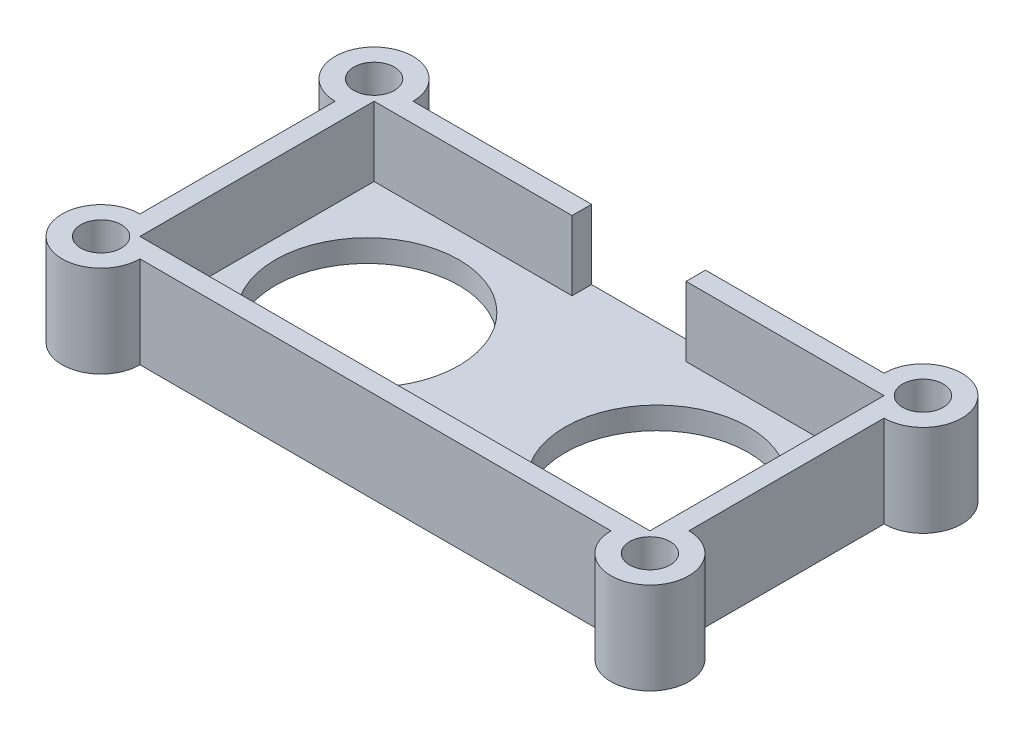
ISO-10303-21;
HEADER;
FILE_DESCRIPTION(('STEP AP214'),'2;1');
FILE_NAME('part.step','',(''),(''),'','','');
FILE_SCHEMA(('AUTOMOTIVE_DESIGN { 1 0 10303 214 1 1 1 1 }'));
ENDSEC;
DATA;
#1=APPLICATION_CONTEXT('core data for automotive mechanical design processes');
#2=APPLICATION_PROTOCOL_DEFINITION('international standard','automotive_design',2000,#1);
#3=PRODUCT_CONTEXT('',#1,'mechanical');
#4=PRODUCT('Part','Part','',(#3));
#5=PRODUCT_RELATED_PRODUCT_CATEGORY('part','',(#4));
#6=PRODUCT_DEFINITION_FORMATION('','',#4);
#7=PRODUCT_DEFINITION_CONTEXT('part definition',#1,'design');
#8=PRODUCT_DEFINITION('design','',#6,#7);
#9=PRODUCT_DEFINITION_SHAPE('','',#8);
#10=(LENGTH_UNIT() NAMED_UNIT(*) SI_UNIT(.MILLI.,.METRE.));
#11=(NAMED_UNIT(*) PLANE_ANGLE_UNIT() SI_UNIT($,.RADIAN.));
#12=(NAMED_UNIT(*) SI_UNIT($,.STERADIAN.) SOLID_ANGLE_UNIT());
#13=UNCERTAINTY_MEASURE_WITH_UNIT(LENGTH_MEASURE(1.E-05),#10,'distance_accuracy_value','');
#14=(GEOMETRIC_REPRESENTATION_CONTEXT(3) GLOBAL_UNCERTAINTY_ASSIGNED_CONTEXT((#13)) GLOBAL_UNIT_ASSIGNED_CONTEXT((#10,
#11,#12)) REPRESENTATION_CONTEXT('',''));
#15=CARTESIAN_POINT('',(0.,0.,0.));
#16=DIRECTION('',(0.,0.,1.));
#17=DIRECTION('',(1.,0.,0.));
#18=AXIS2_PLACEMENT_3D('',#15,#16,#17);
#19=CARTESIAN_POINT('',(-24.675,2.,12.275));
#20=DIRECTION('',(0.,0.,-1.));
#21=DIRECTION('',(-1.,0.,0.));
#22=AXIS2_PLACEMENT_3D('',#19,#20,#21);
#23=PLANE('',#22);
#24=DIRECTION('',(0.,-1.,0.));
#25=VECTOR('',#24,1.);
#26=CARTESIAN_POINT('',(21.175,18.1494949366117,12.275));
#27=LINE('',#26,#25);
#28=CARTESIAN_POINT('',(21.175,8.25,12.275));
#29=VERTEX_POINT('',#28);
#30=CARTESIAN_POINT('',(21.175,0.,12.275));
#31=VERTEX_POINT('',#30);
#32=EDGE_CURVE('E249',#29,#31,#27,.T.);
#33=ORIENTED_EDGE('',*,*,#32,.F.);
#34=DIRECTION('',(1.,0.,0.));
#35=VECTOR('',#34,1.);
#36=CARTESIAN_POINT('',(-24.675,8.25,12.275));
#37=LINE('',#36,#35);
#38=CARTESIAN_POINT('',(-21.175,8.25,12.275));
#39=VERTEX_POINT('',#38);
#40=EDGE_CURVE('E294',#39,#29,#37,.T.);
#41=ORIENTED_EDGE('',*,*,#40,.F.);
#42=DIRECTION('',(0.,-1.,0.));
#43=VECTOR('',#42,1.);
#44=CARTESIAN_POINT('',(-21.175,18.1494949366117,12.275));
#45=LINE('',#44,#43);
#46=CARTESIAN_POINT('',(-21.175,0.,12.275));
#47=VERTEX_POINT('',#46);
#48=EDGE_CURVE('E255',#39,#47,#45,.T.);
#49=ORIENTED_EDGE('',*,*,#48,.T.);
#50=DIRECTION('',(1.,0.,0.));
#51=VECTOR('',#50,1.);
#52=CARTESIAN_POINT('',(-24.675,0.,12.275));
#53=LINE('',#52,#51);
#54=EDGE_CURVE('E361',#47,#31,#53,.T.);
#55=ORIENTED_EDGE('',*,*,#54,.T.);
#56=EDGE_LOOP('',(#33,#41,#49,#55));
#57=FACE_BOUND('',#56,.T.);
#58=ADVANCED_FACE('F32',(#57),#23,.F.);
#59=CARTESIAN_POINT('',(24.675,2.,-12.275));
#60=DIRECTION('',(-1.,0.,0.));
#61=DIRECTION('',(0.,0.,1.));
#62=AXIS2_PLACEMENT_3D('',#59,#60,#61);
#63=PLANE('',#62);
#64=DIRECTION('',(0.,-1.,0.));
#65=VECTOR('',#64,1.);
#66=CARTESIAN_POINT('',(24.675,18.1494949366117,8.775));
#67=LINE('',#66,#65);
#68=CARTESIAN_POINT('',(24.675,8.25,8.775));
#69=VERTEX_POINT('',#68);
#70=CARTESIAN_POINT('',(24.675,0.,8.775));
#71=VERTEX_POINT('',#70);
#72=EDGE_CURVE('E244',#69,#71,#67,.T.);
#73=ORIENTED_EDGE('',*,*,#72,.T.);
#74=DIRECTION('',(0.,0.,-1.));
#75=VECTOR('',#74,1.);
#76=CARTESIAN_POINT('',(24.675,0.,-12.275));
#77=LINE('',#76,#75);
#78=CARTESIAN_POINT('',(24.675,0.,-8.775));
#79=VERTEX_POINT('',#78);
#80=EDGE_CURVE('E363',#71,#79,#77,.T.);
#81=ORIENTED_EDGE('',*,*,#80,.T.);
#82=DIRECTION('',(0.,-1.,0.));
#83=VECTOR('',#82,1.);
#84=CARTESIAN_POINT('',(24.675,18.1494949366117,-8.775));
#85=LINE('',#84,#83);
#86=CARTESIAN_POINT('',(24.675,8.25,-8.775));
#87=VERTEX_POINT('',#86);
#88=EDGE_CURVE('E266',#87,#79,#85,.T.);
#89=ORIENTED_EDGE('',*,*,#88,.F.);
#90=DIRECTION('',(0.,0.,-1.));
#91=VECTOR('',#90,1.);
#92=CARTESIAN_POINT('',(24.675,8.25,12.275));
#93=LINE('',#92,#91);
#94=EDGE_CURVE('E297',#69,#87,#93,.T.);
#95=ORIENTED_EDGE('',*,*,#94,.F.);
#96=EDGE_LOOP('',(#73,#81,#89,#95));
#97=FACE_BOUND('',#96,.T.);
#98=ADVANCED_FACE('F421',(#97),#63,.F.);
#99=CARTESIAN_POINT('',(-24.675,2.,-12.275));
#100=DIRECTION('',(1.,0.,0.));
#101=DIRECTION('',(0.,0.,-1.));
#102=AXIS2_PLACEMENT_3D('',#99,#100,#101);
#103=PLANE('',#102);
#104=DIRECTION('',(0.,-1.,0.));
#105=VECTOR('',#104,1.);
#106=CARTESIAN_POINT('',(-24.675,18.1494949366117,8.775));
#107=LINE('',#106,#105);
#108=CARTESIAN_POINT('',(-24.675,8.25,8.775));
#109=VERTEX_POINT('',#108);
#110=CARTESIAN_POINT('',(-24.675,0.,8.775));
#111=VERTEX_POINT('',#110);
#112=EDGE_CURVE('E260',#109,#111,#107,.T.);
#113=ORIENTED_EDGE('',*,*,#112,.F.);
#114=DIRECTION('',(0.,0.,1.));
#115=VECTOR('',#114,1.);
#116=CARTESIAN_POINT('',(-24.675,8.25,-12.275));
#117=LINE('',#116,#115);
#118=CARTESIAN_POINT('',(-24.675,8.25,-8.775));
#119=VERTEX_POINT('',#118);
#120=EDGE_CURVE('E290',#119,#109,#117,.T.);
#121=ORIENTED_EDGE('',*,*,#120,.F.);
#122=DIRECTION('',(0.,-1.,0.));
#123=VECTOR('',#122,1.);
#124=CARTESIAN_POINT('',(-24.675,18.1494949366117,-8.775));
#125=LINE('',#124,#123);
#126=CARTESIAN_POINT('',(-24.675,0.,-8.775));
#127=VERTEX_POINT('',#126);
#128=EDGE_CURVE('E282',#119,#127,#125,.T.);
#129=ORIENTED_EDGE('',*,*,#128,.T.);
#130=DIRECTION('',(0.,0.,1.));
#131=VECTOR('',#130,1.);
#132=CARTESIAN_POINT('',(-24.675,0.,-12.275));
#133=LINE('',#132,#131);
#134=EDGE_CURVE('E357',#127,#111,#133,.T.);
#135=ORIENTED_EDGE('',*,*,#134,.T.);
#136=EDGE_LOOP('',(#113,#121,#129,#135));
#137=FACE_BOUND('',#136,.T.);
#138=ADVANCED_FACE('F34',(#137),#103,.F.);
#139=CARTESIAN_POINT('',(-24.675,2.,-12.275));
#140=DIRECTION('',(0.,0.,1.));
#141=DIRECTION('',(1.,0.,0.));
#142=AXIS2_PLACEMENT_3D('',#139,#140,#141);
#143=PLANE('',#142);
#144=DIRECTION('',(0.,-1.,0.));
#145=VECTOR('',#144,1.);
#146=CARTESIAN_POINT('',(21.175,18.1494949366117,-12.275));
#147=LINE('',#146,#145);
#148=CARTESIAN_POINT('',(21.175,8.25,-12.275));
#149=VERTEX_POINT('',#148);
#150=CARTESIAN_POINT('',(21.175,0.,-12.275));
#151=VERTEX_POINT('',#150);
#152=EDGE_CURVE('E271',#149,#151,#147,.T.);
#153=ORIENTED_EDGE('',*,*,#152,.T.);
#154=DIRECTION('',(-1.,0.,0.));
#155=VECTOR('',#154,1.);
#156=CARTESIAN_POINT('',(-24.675,0.,-12.275));
#157=LINE('',#156,#155);
#158=CARTESIAN_POINT('',(-21.175,0.,-12.275));
#159=VERTEX_POINT('',#158);
#160=EDGE_CURVE('E36',#151,#159,#157,.T.);
#161=ORIENTED_EDGE('',*,*,#160,.T.);
#162=DIRECTION('',(0.,-1.,0.));
#163=VECTOR('',#162,1.);
#164=CARTESIAN_POINT('',(-21.175,18.1494949366117,-12.275));
#165=LINE('',#164,#163);
#166=CARTESIAN_POINT('',(-21.175,8.25,-12.275));
#167=VERTEX_POINT('',#166);
#168=EDGE_CURVE('E278',#167,#159,#165,.T.);
#169=ORIENTED_EDGE('',*,*,#168,.F.);
#170=DIRECTION('',(-1.,0.,0.));
#171=VECTOR('',#170,1.);
#172=CARTESIAN_POINT('',(-5.12499999999999,8.25,-12.275));
#173=LINE('',#172,#171);
#174=CARTESIAN_POINT('',(-5.12499999999999,8.25,-12.275));
#175=VERTEX_POINT('',#174);
#176=EDGE_CURVE('E287',#175,#167,#173,.T.);
#177=ORIENTED_EDGE('',*,*,#176,.F.);
#178=DIRECTION('',(0.,-1.,0.));
#179=VECTOR('',#178,1.);
#180=CARTESIAN_POINT('',(-5.12499999999999,8.25,-12.275));
#181=LINE('',#180,#179);
#182=CARTESIAN_POINT('',(-5.12499999999999,2.,-12.275));
#183=VERTEX_POINT('',#182);
#184=EDGE_CURVE('E315',#175,#183,#181,.T.);
#185=ORIENTED_EDGE('',*,*,#184,.T.);
#186=DIRECTION('',(-1.,0.,0.));
#187=VECTOR('',#186,1.);
#188=CARTESIAN_POINT('',(-24.675,2.,-12.275));
#189=LINE('',#188,#187);
#190=CARTESIAN_POINT('',(5.125,2.,-12.275));
#191=VERTEX_POINT('',#190);
#192=EDGE_CURVE('E11',#191,#183,#189,.T.);
#193=ORIENTED_EDGE('',*,*,#192,.F.);
#194=DIRECTION('',(0.,-1.,0.));
#195=VECTOR('',#194,1.);
#196=CARTESIAN_POINT('',(5.125,8.25,-12.275));
#197=LINE('',#196,#195);
#198=CARTESIAN_POINT('',(5.125,8.25,-12.275));
#199=VERTEX_POINT('',#198);
#200=EDGE_CURVE('E355',#199,#191,#197,.T.);
#201=ORIENTED_EDGE('',*,*,#200,.F.);
#202=DIRECTION('',(-1.,0.,0.));
#203=VECTOR('',#202,1.);
#204=CARTESIAN_POINT('',(24.675,8.25,-12.275));
#205=LINE('',#204,#203);
#206=EDGE_CURVE('E299',#149,#199,#205,.T.);
#207=ORIENTED_EDGE('',*,*,#206,.F.);
#208=EDGE_LOOP('',(#153,#161,#169,#177,#185,#193,#201,#207));
#209=FACE_BOUND('',#208,.T.);
#210=ADVANCED_FACE('F370',(#209),#143,.F.);
#211=CARTESIAN_POINT('',(0.,2.,0.));
#212=DIRECTION('',(0.,1.,0.));
#213=DIRECTION('',(0.,0.,1.));
#214=AXIS2_PLACEMENT_3D('',#211,#212,#213);
#215=PLANE('',#214);
#216=CARTESIAN_POINT('',(13.025,2.,0.));
#217=DIRECTION('',(0.,1.,0.));
#218=DIRECTION('',(0.,0.,1.));
#219=AXIS2_PLACEMENT_3D('',#216,#217,#218);
#220=CIRCLE('',#219,8.25);
#221=CARTESIAN_POINT('',(13.025,2.,8.25));
#222=VERTEX_POINT('',#221);
#223=EDGE_CURVE('E238',#222,#222,#220,.T.);
#224=ORIENTED_EDGE('',*,*,#223,.F.);
#225=EDGE_LOOP('',(#224));
#226=FACE_BOUND('',#225,.T.);
#227=CARTESIAN_POINT('',(-2.99999999999999,2.,7.35));
#228=DIRECTION('',(0.,1.,0.));
#229=DIRECTION('',(0.,0.,1.));
#230=AXIS2_PLACEMENT_3D('',#227,#228,#229);
#231=CIRCLE('',#230,2.375);
#232=CARTESIAN_POINT('',(-2.99999999999999,2.,4.975));
#233=VERTEX_POINT('',#232);
#234=CARTESIAN_POINT('',(-2.99999999999999,2.,9.725));
#235=VERTEX_POINT('',#234);
#236=EDGE_CURVE('E175',#233,#235,#231,.T.);
#237=ORIENTED_EDGE('',*,*,#236,.F.);
#238=DIRECTION('',(-1.,0.,0.));
#239=VECTOR('',#238,1.);
#240=CARTESIAN_POINT('',(0.,2.,4.975));
#241=LINE('',#240,#239);
#242=CARTESIAN_POINT('',(3.25000000000001,2.,4.975));
#243=VERTEX_POINT('',#242);
#244=EDGE_CURVE('E235',#243,#233,#241,.T.);
#245=ORIENTED_EDGE('',*,*,#244,.F.);
#246=CARTESIAN_POINT('',(3.25000000000001,2.,7.35));
#247=DIRECTION('',(0.,1.,0.));
#248=DIRECTION('',(0.,0.,1.));
#249=AXIS2_PLACEMENT_3D('',#246,#247,#248);
#250=CIRCLE('',#249,2.375);
#251=CARTESIAN_POINT('',(3.25000000000001,2.,9.725));
#252=VERTEX_POINT('',#251);
#253=EDGE_CURVE('E233',#252,#243,#250,.T.);
#254=ORIENTED_EDGE('',*,*,#253,.F.);
#255=DIRECTION('',(1.,0.,0.));
#256=VECTOR('',#255,1.);
#257=CARTESIAN_POINT('',(0.,2.,9.725));
#258=LINE('',#257,#256);
#259=EDGE_CURVE('E231',#235,#252,#258,.T.);
#260=ORIENTED_EDGE('',*,*,#259,.F.);
#261=EDGE_LOOP('',(#237,#245,#254,#260));
#262=FACE_BOUND('',#261,.T.);
#263=CARTESIAN_POINT('',(-13.025,2.,0.));
#264=DIRECTION('',(0.,1.,0.));
#265=DIRECTION('',(0.,0.,1.));
#266=AXIS2_PLACEMENT_3D('',#263,#264,#265);
#267=CIRCLE('',#266,8.25);
#268=CARTESIAN_POINT('',(-13.025,2.,8.25));
#269=VERTEX_POINT('',#268);
#270=EDGE_CURVE('E228',#269,#269,#267,.T.);
#271=ORIENTED_EDGE('',*,*,#270,.F.);
#272=EDGE_LOOP('',(#271));
#273=FACE_BOUND('',#272,.T.);
#274=DIRECTION('',(0.,0.,-1.));
#275=VECTOR('',#274,1.);
#276=CARTESIAN_POINT('',(-5.12499999999999,2.,-10.525));
#277=LINE('',#276,#275);
#278=CARTESIAN_POINT('',(-5.12499999999999,2.,-10.525));
#279=VERTEX_POINT('',#278);
#280=EDGE_CURVE('E291',#279,#183,#277,.T.);
#281=ORIENTED_EDGE('',*,*,#280,.F.);
#282=DIRECTION('',(1.,0.,0.));
#283=VECTOR('',#282,1.);
#284=CARTESIAN_POINT('',(-22.925,2.,-10.525));
#285=LINE('',#284,#283);
#286=CARTESIAN_POINT('',(-22.925,2.,-10.525));
#287=VERTEX_POINT('',#286);
#288=EDGE_CURVE('E330',#287,#279,#285,.T.);
#289=ORIENTED_EDGE('',*,*,#288,.F.);
#290=DIRECTION('',(0.,0.,-1.));
#291=VECTOR('',#290,1.);
#292=CARTESIAN_POINT('',(-22.925,2.,10.525));
#293=LINE('',#292,#291);
#294=CARTESIAN_POINT('',(-22.925,2.,10.525));
#295=VERTEX_POINT('',#294);
#296=EDGE_CURVE('E327',#295,#287,#293,.T.);
#297=ORIENTED_EDGE('',*,*,#296,.F.);
#298=DIRECTION('',(-1.,0.,0.));
#299=VECTOR('',#298,1.);
#300=CARTESIAN_POINT('',(22.925,2.,10.525));
#301=LINE('',#300,#299);
#302=CARTESIAN_POINT('',(22.925,2.,10.525));
#303=VERTEX_POINT('',#302);
#304=EDGE_CURVE('E324',#303,#295,#301,.T.);
#305=ORIENTED_EDGE('',*,*,#304,.F.);
#306=DIRECTION('',(0.,0.,1.));
#307=VECTOR('',#306,1.);
#308=CARTESIAN_POINT('',(22.925,2.,-10.525));
#309=LINE('',#308,#307);
#310=CARTESIAN_POINT('',(22.925,2.,-10.525));
#311=VERTEX_POINT('',#310);
#312=EDGE_CURVE('E321',#311,#303,#309,.T.);
#313=ORIENTED_EDGE('',*,*,#312,.F.);
#314=DIRECTION('',(1.,0.,0.));
#315=VECTOR('',#314,1.);
#316=CARTESIAN_POINT('',(5.125,2.,-10.525));
#317=LINE('',#316,#315);
#318=CARTESIAN_POINT('',(5.125,2.,-10.525));
#319=VERTEX_POINT('',#318);
#320=EDGE_CURVE('E318',#319,#311,#317,.T.);
#321=ORIENTED_EDGE('',*,*,#320,.F.);
#322=DIRECTION('',(0.,0.,1.));
#323=VECTOR('',#322,1.);
#324=CARTESIAN_POINT('',(5.125,2.,-12.275));
#325=LINE('',#324,#323);
#326=EDGE_CURVE('E281',#191,#319,#325,.T.);
#327=ORIENTED_EDGE('',*,*,#326,.F.);
#328=ORIENTED_EDGE('',*,*,#192,.T.);
#329=EDGE_LOOP('',(#281,#289,#297,#305,#313,#321,#327,#328));
#330=FACE_BOUND('',#329,.T.);
#331=ADVANCED_FACE('F393',(#226,#262,#273,#330),#215,.T.);
#332=CARTESIAN_POINT('',(0.,0.,0.));
#333=DIRECTION('',(0.,1.,0.));
#334=DIRECTION('',(0.,0.,1.));
#335=AXIS2_PLACEMENT_3D('',#332,#333,#334);
#336=PLANE('',#335);
#337=CARTESIAN_POINT('',(24.675,0.,12.275));
#338=DIRECTION('',(0.,1.,0.));
#339=DIRECTION('',(0.,0.,1.));
#340=AXIS2_PLACEMENT_3D('',#337,#338,#339);
#341=CIRCLE('',#340,1.825);
#342=CARTESIAN_POINT('',(24.675,0.,14.1));
#343=VERTEX_POINT('',#342);
#344=EDGE_CURVE('E218',#343,#343,#341,.T.);
#345=ORIENTED_EDGE('',*,*,#344,.T.);
#346=EDGE_LOOP('',(#345));
#347=FACE_BOUND('',#346,.T.);
#348=CARTESIAN_POINT('',(24.675,0.,-12.275));
#349=DIRECTION('',(0.,1.,0.));
#350=DIRECTION('',(0.,0.,1.));
#351=AXIS2_PLACEMENT_3D('',#348,#349,#350);
#352=CIRCLE('',#351,1.825);
#353=CARTESIAN_POINT('',(24.675,0.,-10.45));
#354=VERTEX_POINT('',#353);
#355=EDGE_CURVE('E212',#354,#354,#352,.T.);
#356=ORIENTED_EDGE('',*,*,#355,.T.);
#357=EDGE_LOOP('',(#356));
#358=FACE_BOUND('',#357,.T.);
#359=CARTESIAN_POINT('',(-24.675,0.,-12.275));
#360=DIRECTION('',(0.,1.,0.));
#361=DIRECTION('',(0.,0.,1.));
#362=AXIS2_PLACEMENT_3D('',#359,#360,#361);
#363=CIRCLE('',#362,1.825);
#364=CARTESIAN_POINT('',(-24.675,0.,-10.45));
#365=VERTEX_POINT('',#364);
#366=EDGE_CURVE('E207',#365,#365,#363,.T.);
#367=ORIENTED_EDGE('',*,*,#366,.T.);
#368=EDGE_LOOP('',(#367));
#369=FACE_BOUND('',#368,.T.);
#370=CARTESIAN_POINT('',(-24.675,0.,12.275));
#371=DIRECTION('',(0.,1.,0.));
#372=DIRECTION('',(0.,0.,1.));
#373=AXIS2_PLACEMENT_3D('',#370,#371,#372);
#374=CIRCLE('',#373,1.825);
#375=CARTESIAN_POINT('',(-24.675,0.,14.1));
#376=VERTEX_POINT('',#375);
#377=EDGE_CURVE('E188',#376,#376,#374,.T.);
#378=ORIENTED_EDGE('',*,*,#377,.T.);
#379=EDGE_LOOP('',(#378));
#380=FACE_BOUND('',#379,.T.);
#381=CARTESIAN_POINT('',(13.025,0.,0.));
#382=DIRECTION('',(0.,1.,0.));
#383=DIRECTION('',(0.,0.,1.));
#384=AXIS2_PLACEMENT_3D('',#381,#382,#383);
#385=CIRCLE('',#384,8.25);
#386=CARTESIAN_POINT('',(13.025,0.,8.25));
#387=VERTEX_POINT('',#386);
#388=EDGE_CURVE('E198',#387,#387,#385,.T.);
#389=ORIENTED_EDGE('',*,*,#388,.T.);
#390=EDGE_LOOP('',(#389));
#391=FACE_BOUND('',#390,.T.);
#392=DIRECTION('',(-1.,0.,0.));
#393=VECTOR('',#392,1.);
#394=CARTESIAN_POINT('',(-2.99999999999999,0.,4.975));
#395=LINE('',#394,#393);
#396=CARTESIAN_POINT('',(3.25000000000001,0.,4.975));
#397=VERTEX_POINT('',#396);
#398=CARTESIAN_POINT('',(-2.99999999999999,0.,4.975));
#399=VERTEX_POINT('',#398);
#400=EDGE_CURVE('E178',#397,#399,#395,.T.);
#401=ORIENTED_EDGE('',*,*,#400,.T.);
#402=CARTESIAN_POINT('',(-2.99999999999999,0.,7.35));
#403=DIRECTION('',(0.,1.,0.));
#404=DIRECTION('',(0.,0.,1.));
#405=AXIS2_PLACEMENT_3D('',#402,#403,#404);
#406=CIRCLE('',#405,2.375);
#407=CARTESIAN_POINT('',(-2.99999999999999,0.,9.725));
#408=VERTEX_POINT('',#407);
#409=EDGE_CURVE('E172',#399,#408,#406,.T.);
#410=ORIENTED_EDGE('',*,*,#409,.T.);
#411=DIRECTION('',(1.,0.,0.));
#412=VECTOR('',#411,1.);
#413=CARTESIAN_POINT('',(-2.99999999999999,0.,9.725));
#414=LINE('',#413,#412);
#415=CARTESIAN_POINT('',(3.25000000000001,0.,9.725));
#416=VERTEX_POINT('',#415);
#417=EDGE_CURVE('E181',#408,#416,#414,.T.);
#418=ORIENTED_EDGE('',*,*,#417,.T.);
#419=CARTESIAN_POINT('',(3.25000000000001,0.,7.35));
#420=DIRECTION('',(0.,1.,0.));
#421=DIRECTION('',(0.,0.,1.));
#422=AXIS2_PLACEMENT_3D('',#419,#420,#421);
#423=CIRCLE('',#422,2.375);
#424=EDGE_CURVE('E56',#416,#397,#423,.T.);
#425=ORIENTED_EDGE('',*,*,#424,.T.);
#426=EDGE_LOOP('',(#401,#410,#418,#425));
#427=FACE_BOUND('',#426,.T.);
#428=CARTESIAN_POINT('',(-13.025,0.,0.));
#429=DIRECTION('',(0.,1.,0.));
#430=DIRECTION('',(0.,0.,1.));
#431=AXIS2_PLACEMENT_3D('',#428,#429,#430);
#432=CIRCLE('',#431,8.25);
#433=CARTESIAN_POINT('',(-13.025,0.,8.25));
#434=VERTEX_POINT('',#433);
#435=EDGE_CURVE('E205',#434,#434,#432,.T.);
#436=ORIENTED_EDGE('',*,*,#435,.T.);
#437=EDGE_LOOP('',(#436));
#438=FACE_BOUND('',#437,.T.);
#439=ORIENTED_EDGE('',*,*,#80,.F.);
#440=CARTESIAN_POINT('',(24.675,0.,12.275));
#441=DIRECTION('',(0.,1.,0.));
#442=DIRECTION('',(0.,0.,1.));
#443=AXIS2_PLACEMENT_3D('',#440,#441,#442);
#444=CIRCLE('',#443,3.5);
#445=EDGE_CURVE('E241',#71,#31,#444,.F.);
#446=ORIENTED_EDGE('',*,*,#445,.T.);
#447=ORIENTED_EDGE('',*,*,#54,.F.);
#448=CARTESIAN_POINT('',(-24.675,0.,12.275));
#449=DIRECTION('',(0.,1.,0.));
#450=DIRECTION('',(0.,0.,1.));
#451=AXIS2_PLACEMENT_3D('',#448,#449,#450);
#452=CIRCLE('',#451,3.5);
#453=EDGE_CURVE('E248',#47,#111,#452,.F.);
#454=ORIENTED_EDGE('',*,*,#453,.T.);
#455=ORIENTED_EDGE('',*,*,#134,.F.);
#456=CARTESIAN_POINT('',(-24.675,0.,-12.275));
#457=DIRECTION('',(0.,1.,0.));
#458=DIRECTION('',(0.,0.,1.));
#459=AXIS2_PLACEMENT_3D('',#456,#457,#458);
#460=CIRCLE('',#459,3.5);
#461=EDGE_CURVE('E270',#127,#159,#460,.F.);
#462=ORIENTED_EDGE('',*,*,#461,.T.);
#463=ORIENTED_EDGE('',*,*,#160,.F.);
#464=CARTESIAN_POINT('',(24.675,0.,-12.275));
#465=DIRECTION('',(0.,1.,0.));
#466=DIRECTION('',(0.,0.,1.));
#467=AXIS2_PLACEMENT_3D('',#464,#465,#466);
#468=CIRCLE('',#467,3.5);
#469=EDGE_CURVE('E259',#151,#79,#468,.F.);
#470=ORIENTED_EDGE('',*,*,#469,.T.);
#471=EDGE_LOOP('',(#439,#446,#447,#454,#455,#462,#463,#470));
#472=FACE_BOUND('',#471,.T.);
#473=ADVANCED_FACE('F185',(#347,#358,#369,#380,#391,#427,#438,#472),#336,.F.);
#474=CARTESIAN_POINT('',(5.125,8.25,-12.275));
#475=DIRECTION('',(1.,0.,0.));
#476=DIRECTION('',(0.,0.,-1.));
#477=AXIS2_PLACEMENT_3D('',#474,#475,#476);
#478=PLANE('',#477);
#479=ORIENTED_EDGE('',*,*,#326,.T.);
#480=DIRECTION('',(0.,-1.,0.));
#481=VECTOR('',#480,1.);
#482=CARTESIAN_POINT('',(5.125,8.25,-10.525));
#483=LINE('',#482,#481);
#484=CARTESIAN_POINT('',(5.125,8.25,-10.525));
#485=VERTEX_POINT('',#484);
#486=EDGE_CURVE('E352',#485,#319,#483,.T.);
#487=ORIENTED_EDGE('',*,*,#486,.F.);
#488=DIRECTION('',(0.,0.,1.));
#489=VECTOR('',#488,1.);
#490=CARTESIAN_POINT('',(5.125,8.25,-12.275));
#491=LINE('',#490,#489);
#492=EDGE_CURVE('E301',#199,#485,#491,.T.);
#493=ORIENTED_EDGE('',*,*,#492,.F.);
#494=ORIENTED_EDGE('',*,*,#200,.T.);
#495=EDGE_LOOP('',(#479,#487,#493,#494));
#496=FACE_BOUND('',#495,.T.);
#497=ADVANCED_FACE('F416',(#496),#478,.F.);
#498=CARTESIAN_POINT('',(5.125,8.25,-10.525));
#499=DIRECTION('',(0.,0.,-1.));
#500=DIRECTION('',(-1.,0.,0.));
#501=AXIS2_PLACEMENT_3D('',#498,#499,#500);
#502=PLANE('',#501);
#503=ORIENTED_EDGE('',*,*,#320,.T.);
#504=DIRECTION('',(0.,-1.,0.));
#505=VECTOR('',#504,1.);
#506=CARTESIAN_POINT('',(22.925,8.25,-10.525));
#507=LINE('',#506,#505);
#508=CARTESIAN_POINT('',(22.925,8.25,-10.525));
#509=VERTEX_POINT('',#508);
#510=EDGE_CURVE('E349',#509,#311,#507,.T.);
#511=ORIENTED_EDGE('',*,*,#510,.F.);
#512=DIRECTION('',(1.,0.,0.));
#513=VECTOR('',#512,1.);
#514=CARTESIAN_POINT('',(5.125,8.25,-10.525));
#515=LINE('',#514,#513);
#516=EDGE_CURVE('E303',#485,#509,#515,.T.);
#517=ORIENTED_EDGE('',*,*,#516,.F.);
#518=ORIENTED_EDGE('',*,*,#486,.T.);
#519=EDGE_LOOP('',(#503,#511,#517,#518));
#520=FACE_BOUND('',#519,.T.);
#521=ADVANCED_FACE('F411',(#520),#502,.F.);
#522=CARTESIAN_POINT('',(22.925,8.25,-10.525));
#523=DIRECTION('',(1.,0.,0.));
#524=DIRECTION('',(0.,0.,-1.));
#525=AXIS2_PLACEMENT_3D('',#522,#523,#524);
#526=PLANE('',#525);
#527=ORIENTED_EDGE('',*,*,#312,.T.);
#528=DIRECTION('',(0.,-1.,0.));
#529=VECTOR('',#528,1.);
#530=CARTESIAN_POINT('',(22.925,8.25,10.525));
#531=LINE('',#530,#529);
#532=CARTESIAN_POINT('',(22.925,8.25,10.525));
#533=VERTEX_POINT('',#532);
#534=EDGE_CURVE('E346',#533,#303,#531,.T.);
#535=ORIENTED_EDGE('',*,*,#534,.F.);
#536=DIRECTION('',(0.,0.,1.));
#537=VECTOR('',#536,1.);
#538=CARTESIAN_POINT('',(22.925,8.25,-10.525));
#539=LINE('',#538,#537);
#540=EDGE_CURVE('E305',#509,#533,#539,.T.);
#541=ORIENTED_EDGE('',*,*,#540,.F.);
#542=ORIENTED_EDGE('',*,*,#510,.T.);
#543=EDGE_LOOP('',(#527,#535,#541,#542));
#544=FACE_BOUND('',#543,.T.);
#545=ADVANCED_FACE('F408',(#544),#526,.F.);
#546=CARTESIAN_POINT('',(22.925,8.25,10.525));
#547=DIRECTION('',(0.,0.,1.));
#548=DIRECTION('',(1.,0.,0.));
#549=AXIS2_PLACEMENT_3D('',#546,#547,#548);
#550=PLANE('',#549);
#551=ORIENTED_EDGE('',*,*,#304,.T.);
#552=DIRECTION('',(0.,-1.,0.));
#553=VECTOR('',#552,1.);
#554=CARTESIAN_POINT('',(-22.925,8.25,10.525));
#555=LINE('',#554,#553);
#556=CARTESIAN_POINT('',(-22.925,8.25,10.525));
#557=VERTEX_POINT('',#556);
#558=EDGE_CURVE('E343',#557,#295,#555,.T.);
#559=ORIENTED_EDGE('',*,*,#558,.F.);
#560=DIRECTION('',(-1.,0.,0.));
#561=VECTOR('',#560,1.);
#562=CARTESIAN_POINT('',(22.925,8.25,10.525));
#563=LINE('',#562,#561);
#564=EDGE_CURVE('E307',#533,#557,#563,.T.);
#565=ORIENTED_EDGE('',*,*,#564,.F.);
#566=ORIENTED_EDGE('',*,*,#534,.T.);
#567=EDGE_LOOP('',(#551,#559,#565,#566));
#568=FACE_BOUND('',#567,.T.);
#569=ADVANCED_FACE('F403',(#568),#550,.F.);
#570=CARTESIAN_POINT('',(-22.925,8.25,10.525));
#571=DIRECTION('',(-1.,0.,0.));
#572=DIRECTION('',(0.,0.,1.));
#573=AXIS2_PLACEMENT_3D('',#570,#571,#572);
#574=PLANE('',#573);
#575=ORIENTED_EDGE('',*,*,#296,.T.);
#576=DIRECTION('',(0.,-1.,0.));
#577=VECTOR('',#576,1.);
#578=CARTESIAN_POINT('',(-22.925,8.25,-10.525));
#579=LINE('',#578,#577);
#580=CARTESIAN_POINT('',(-22.925,8.25,-10.525));
#581=VERTEX_POINT('',#580);
#582=EDGE_CURVE('E340',#581,#287,#579,.T.);
#583=ORIENTED_EDGE('',*,*,#582,.F.);
#584=DIRECTION('',(0.,0.,-1.));
#585=VECTOR('',#584,1.);
#586=CARTESIAN_POINT('',(-22.925,8.25,10.525));
#587=LINE('',#586,#585);
#588=EDGE_CURVE('E309',#557,#581,#587,.T.);
#589=ORIENTED_EDGE('',*,*,#588,.F.);
#590=ORIENTED_EDGE('',*,*,#558,.T.);
#591=EDGE_LOOP('',(#575,#583,#589,#590));
#592=FACE_BOUND('',#591,.T.);
#593=ADVANCED_FACE('F400',(#592),#574,.F.);
#594=CARTESIAN_POINT('',(-22.925,8.25,-10.525));
#595=DIRECTION('',(0.,0.,-1.));
#596=DIRECTION('',(-1.,0.,0.));
#597=AXIS2_PLACEMENT_3D('',#594,#595,#596);
#598=PLANE('',#597);
#599=ORIENTED_EDGE('',*,*,#288,.T.);
#600=DIRECTION('',(0.,-1.,0.));
#601=VECTOR('',#600,1.);
#602=CARTESIAN_POINT('',(-5.12499999999999,8.25,-10.525));
#603=LINE('',#602,#601);
#604=CARTESIAN_POINT('',(-5.12499999999999,8.25,-10.525));
#605=VERTEX_POINT('',#604);
#606=EDGE_CURVE('E337',#605,#279,#603,.T.);
#607=ORIENTED_EDGE('',*,*,#606,.F.);
#608=DIRECTION('',(1.,0.,0.));
#609=VECTOR('',#608,1.);
#610=CARTESIAN_POINT('',(-22.925,8.25,-10.525));
#611=LINE('',#610,#609);
#612=EDGE_CURVE('E311',#581,#605,#611,.T.);
#613=ORIENTED_EDGE('',*,*,#612,.F.);
#614=ORIENTED_EDGE('',*,*,#582,.T.);
#615=EDGE_LOOP('',(#599,#607,#613,#614));
#616=FACE_BOUND('',#615,.T.);
#617=ADVANCED_FACE('F395',(#616),#598,.F.);
#618=CARTESIAN_POINT('',(-5.12499999999999,8.25,-10.525));
#619=DIRECTION('',(-1.,0.,0.));
#620=DIRECTION('',(0.,0.,1.));
#621=AXIS2_PLACEMENT_3D('',#618,#619,#620);
#622=PLANE('',#621);
#623=ORIENTED_EDGE('',*,*,#280,.T.);
#624=ORIENTED_EDGE('',*,*,#184,.F.);
#625=DIRECTION('',(0.,0.,-1.));
#626=VECTOR('',#625,1.);
#627=CARTESIAN_POINT('',(-5.12499999999999,8.25,-10.525));
#628=LINE('',#627,#626);
#629=EDGE_CURVE('E313',#605,#175,#628,.T.);
#630=ORIENTED_EDGE('',*,*,#629,.F.);
#631=ORIENTED_EDGE('',*,*,#606,.T.);
#632=EDGE_LOOP('',(#623,#624,#630,#631));
#633=FACE_BOUND('',#632,.T.);
#634=ADVANCED_FACE('F390',(#633),#622,.F.);
#635=CARTESIAN_POINT('',(0.,8.25,0.));
#636=DIRECTION('',(0.,1.,0.));
#637=DIRECTION('',(0.,0.,1.));
#638=AXIS2_PLACEMENT_3D('',#635,#636,#637);
#639=PLANE('',#638);
#640=CARTESIAN_POINT('',(24.675,8.25,12.275));
#641=DIRECTION('',(0.,1.,0.));
#642=DIRECTION('',(0.,0.,1.));
#643=AXIS2_PLACEMENT_3D('',#640,#641,#642);
#644=CIRCLE('',#643,1.825);
#645=CARTESIAN_POINT('',(24.675,8.25,14.1));
#646=VERTEX_POINT('',#645);
#647=EDGE_CURVE('E221',#646,#646,#644,.T.);
#648=ORIENTED_EDGE('',*,*,#647,.F.);
#649=EDGE_LOOP('',(#648));
#650=FACE_BOUND('',#649,.T.);
#651=CARTESIAN_POINT('',(24.675,8.25,-12.275));
#652=DIRECTION('',(0.,1.,0.));
#653=DIRECTION('',(0.,0.,1.));
#654=AXIS2_PLACEMENT_3D('',#651,#652,#653);
#655=CIRCLE('',#654,1.825);
#656=CARTESIAN_POINT('',(24.675,8.25,-10.45));
#657=VERTEX_POINT('',#656);
#658=EDGE_CURVE('E215',#657,#657,#655,.T.);
#659=ORIENTED_EDGE('',*,*,#658,.F.);
#660=EDGE_LOOP('',(#659));
#661=FACE_BOUND('',#660,.T.);
#662=CARTESIAN_POINT('',(-24.675,8.25,-12.275));
#663=DIRECTION('',(0.,1.,0.));
#664=DIRECTION('',(0.,0.,1.));
#665=AXIS2_PLACEMENT_3D('',#662,#663,#664);
#666=CIRCLE('',#665,1.825);
#667=CARTESIAN_POINT('',(-24.675,8.25,-10.45));
#668=VERTEX_POINT('',#667);
#669=EDGE_CURVE('E209',#668,#668,#666,.T.);
#670=ORIENTED_EDGE('',*,*,#669,.F.);
#671=EDGE_LOOP('',(#670));
#672=FACE_BOUND('',#671,.T.);
#673=CARTESIAN_POINT('',(-24.675,8.25,12.275));
#674=DIRECTION('',(0.,1.,0.));
#675=DIRECTION('',(0.,0.,1.));
#676=AXIS2_PLACEMENT_3D('',#673,#674,#675);
#677=CIRCLE('',#676,1.825);
#678=CARTESIAN_POINT('',(-24.675,8.25,14.1));
#679=VERTEX_POINT('',#678);
#680=EDGE_CURVE('E191',#679,#679,#677,.T.);
#681=ORIENTED_EDGE('',*,*,#680,.F.);
#682=EDGE_LOOP('',(#681));
#683=FACE_BOUND('',#682,.T.);
#684=CARTESIAN_POINT('',(24.675,8.25,12.275));
#685=DIRECTION('',(0.,1.,0.));
#686=DIRECTION('',(0.,0.,1.));
#687=AXIS2_PLACEMENT_3D('',#684,#685,#686);
#688=CIRCLE('',#687,3.5);
#689=EDGE_CURVE('E245',#29,#69,#688,.T.);
#690=ORIENTED_EDGE('',*,*,#689,.T.);
#691=ORIENTED_EDGE('',*,*,#94,.T.);
#692=CARTESIAN_POINT('',(24.675,8.25,-12.275));
#693=DIRECTION('',(0.,1.,0.));
#694=DIRECTION('',(0.,0.,1.));
#695=AXIS2_PLACEMENT_3D('',#692,#693,#694);
#696=CIRCLE('',#695,3.5);
#697=EDGE_CURVE('E267',#87,#149,#696,.T.);
#698=ORIENTED_EDGE('',*,*,#697,.T.);
#699=ORIENTED_EDGE('',*,*,#206,.T.);
#700=ORIENTED_EDGE('',*,*,#492,.T.);
#701=ORIENTED_EDGE('',*,*,#516,.T.);
#702=ORIENTED_EDGE('',*,*,#540,.T.);
#703=ORIENTED_EDGE('',*,*,#564,.T.);
#704=ORIENTED_EDGE('',*,*,#588,.T.);
#705=ORIENTED_EDGE('',*,*,#612,.T.);
#706=ORIENTED_EDGE('',*,*,#629,.T.);
#707=ORIENTED_EDGE('',*,*,#176,.T.);
#708=CARTESIAN_POINT('',(-24.675,8.25,-12.275));
#709=DIRECTION('',(0.,1.,0.));
#710=DIRECTION('',(0.,0.,1.));
#711=AXIS2_PLACEMENT_3D('',#708,#709,#710);
#712=CIRCLE('',#711,3.5);
#713=EDGE_CURVE('E279',#167,#119,#712,.T.);
#714=ORIENTED_EDGE('',*,*,#713,.T.);
#715=ORIENTED_EDGE('',*,*,#120,.T.);
#716=CARTESIAN_POINT('',(-24.675,8.25,12.275));
#717=DIRECTION('',(0.,1.,0.));
#718=DIRECTION('',(0.,0.,1.));
#719=AXIS2_PLACEMENT_3D('',#716,#717,#718);
#720=CIRCLE('',#719,3.5);
#721=EDGE_CURVE('E256',#109,#39,#720,.T.);
#722=ORIENTED_EDGE('',*,*,#721,.T.);
#723=ORIENTED_EDGE('',*,*,#40,.T.);
#724=EDGE_LOOP('',(#690,#691,#698,#699,#700,#701,#702,#703,#704,#705,#706,#707,#714,#715,#722,#723));
#725=FACE_BOUND('',#724,.T.);
#726=ADVANCED_FACE('F383',(#650,#661,#672,#683,#725),#639,.T.);
#727=CARTESIAN_POINT('',(-24.675,18.1494949366117,-12.275));
#728=DIRECTION('',(0.,-1.,0.));
#729=DIRECTION('',(0.,0.,-1.));
#730=AXIS2_PLACEMENT_3D('',#727,#728,#729);
#731=CYLINDRICAL_SURFACE('',#730,3.5);
#732=ORIENTED_EDGE('',*,*,#713,.F.);
#733=ORIENTED_EDGE('',*,*,#168,.T.);
#734=ORIENTED_EDGE('',*,*,#461,.F.);
#735=ORIENTED_EDGE('',*,*,#128,.F.);
#736=EDGE_LOOP('',(#732,#733,#734,#735));
#737=FACE_BOUND('',#736,.T.);
#738=ADVANCED_FACE('F375',(#737),#731,.T.);
#739=CARTESIAN_POINT('',(24.675,18.1494949366117,-12.275));
#740=DIRECTION('',(0.,-1.,0.));
#741=DIRECTION('',(0.,0.,-1.));
#742=AXIS2_PLACEMENT_3D('',#739,#740,#741);
#743=CYLINDRICAL_SURFACE('',#742,3.5);
#744=ORIENTED_EDGE('',*,*,#697,.F.);
#745=ORIENTED_EDGE('',*,*,#88,.T.);
#746=ORIENTED_EDGE('',*,*,#469,.F.);
#747=ORIENTED_EDGE('',*,*,#152,.F.);
#748=EDGE_LOOP('',(#744,#745,#746,#747));
#749=FACE_BOUND('',#748,.T.);
#750=ADVANCED_FACE('F420',(#749),#743,.T.);
#751=CARTESIAN_POINT('',(-24.675,18.1494949366117,12.275));
#752=DIRECTION('',(0.,-1.,0.));
#753=DIRECTION('',(0.,0.,-1.));
#754=AXIS2_PLACEMENT_3D('',#751,#752,#753);
#755=CYLINDRICAL_SURFACE('',#754,3.5);
#756=ORIENTED_EDGE('',*,*,#721,.F.);
#757=ORIENTED_EDGE('',*,*,#112,.T.);
#758=ORIENTED_EDGE('',*,*,#453,.F.);
#759=ORIENTED_EDGE('',*,*,#48,.F.);
#760=EDGE_LOOP('',(#756,#757,#758,#759));
#761=FACE_BOUND('',#760,.T.);
#762=ADVANCED_FACE('F426',(#761),#755,.T.);
#763=CARTESIAN_POINT('',(24.675,18.1494949366117,12.275));
#764=DIRECTION('',(0.,-1.,0.));
#765=DIRECTION('',(0.,0.,-1.));
#766=AXIS2_PLACEMENT_3D('',#763,#764,#765);
#767=CYLINDRICAL_SURFACE('',#766,3.5);
#768=ORIENTED_EDGE('',*,*,#689,.F.);
#769=ORIENTED_EDGE('',*,*,#32,.T.);
#770=ORIENTED_EDGE('',*,*,#445,.F.);
#771=ORIENTED_EDGE('',*,*,#72,.F.);
#772=EDGE_LOOP('',(#768,#769,#770,#771));
#773=FACE_BOUND('',#772,.T.);
#774=ADVANCED_FACE('F428',(#773),#767,.T.);
#775=CARTESIAN_POINT('',(-24.675,0.,12.275));
#776=DIRECTION('',(0.,1.,0.));
#777=DIRECTION('',(0.,0.,1.));
#778=AXIS2_PLACEMENT_3D('',#775,#776,#777);
#779=CYLINDRICAL_SURFACE('',#778,1.825);
#780=ORIENTED_EDGE('',*,*,#377,.F.);
#781=EDGE_LOOP('',(#780));
#782=FACE_BOUND('',#781,.T.);
#783=ORIENTED_EDGE('',*,*,#680,.T.);
#784=EDGE_LOOP('',(#783));
#785=FACE_BOUND('',#784,.T.);
#786=ADVANCED_FACE('F434',(#782,#785),#779,.F.);
#787=CARTESIAN_POINT('',(-24.675,0.,-12.275));
#788=DIRECTION('',(0.,1.,0.));
#789=DIRECTION('',(0.,0.,1.));
#790=AXIS2_PLACEMENT_3D('',#787,#788,#789);
#791=CYLINDRICAL_SURFACE('',#790,1.825);
#792=ORIENTED_EDGE('',*,*,#366,.F.);
#793=EDGE_LOOP('',(#792));
#794=FACE_BOUND('',#793,.T.);
#795=ORIENTED_EDGE('',*,*,#669,.T.);
#796=EDGE_LOOP('',(#795));
#797=FACE_BOUND('',#796,.T.);
#798=ADVANCED_FACE('F517',(#794,#797),#791,.F.);
#799=CARTESIAN_POINT('',(24.675,0.,-12.275));
#800=DIRECTION('',(0.,1.,0.));
#801=DIRECTION('',(0.,0.,1.));
#802=AXIS2_PLACEMENT_3D('',#799,#800,#801);
#803=CYLINDRICAL_SURFACE('',#802,1.825);
#804=ORIENTED_EDGE('',*,*,#355,.F.);
#805=EDGE_LOOP('',(#804));
#806=FACE_BOUND('',#805,.T.);
#807=ORIENTED_EDGE('',*,*,#658,.T.);
#808=EDGE_LOOP('',(#807));
#809=FACE_BOUND('',#808,.T.);
#810=ADVANCED_FACE('F527',(#806,#809),#803,.F.);
#811=CARTESIAN_POINT('',(24.675,0.,12.275));
#812=DIRECTION('',(0.,1.,0.));
#813=DIRECTION('',(0.,0.,1.));
#814=AXIS2_PLACEMENT_3D('',#811,#812,#813);
#815=CYLINDRICAL_SURFACE('',#814,1.825);
#816=ORIENTED_EDGE('',*,*,#344,.F.);
#817=EDGE_LOOP('',(#816));
#818=FACE_BOUND('',#817,.T.);
#819=ORIENTED_EDGE('',*,*,#647,.T.);
#820=EDGE_LOOP('',(#819));
#821=FACE_BOUND('',#820,.T.);
#822=ADVANCED_FACE('F537',(#818,#821),#815,.F.);
#823=CARTESIAN_POINT('',(-13.025,0.,0.));
#824=DIRECTION('',(0.,1.,0.));
#825=DIRECTION('',(0.,0.,1.));
#826=AXIS2_PLACEMENT_3D('',#823,#824,#825);
#827=CYLINDRICAL_SURFACE('',#826,8.25);
#828=ORIENTED_EDGE('',*,*,#270,.T.);
#829=EDGE_LOOP('',(#828));
#830=FACE_BOUND('',#829,.T.);
#831=ORIENTED_EDGE('',*,*,#435,.F.);
#832=EDGE_LOOP('',(#831));
#833=FACE_BOUND('',#832,.T.);
#834=ADVANCED_FACE('F547',(#830,#833),#827,.F.);
#835=CARTESIAN_POINT('',(-2.99999999999999,0.,7.35));
#836=DIRECTION('',(0.,1.,0.));
#837=DIRECTION('',(0.,0.,1.));
#838=AXIS2_PLACEMENT_3D('',#835,#836,#837);
#839=CYLINDRICAL_SURFACE('',#838,2.375);
#840=ORIENTED_EDGE('',*,*,#236,.T.);
#841=DIRECTION('',(0.,1.,0.));
#842=VECTOR('',#841,1.);
#843=CARTESIAN_POINT('',(-2.99999999999999,0.,9.725));
#844=LINE('',#843,#842);
#845=EDGE_CURVE('E48',#408,#235,#844,.T.);
#846=ORIENTED_EDGE('',*,*,#845,.F.);
#847=ORIENTED_EDGE('',*,*,#409,.F.);
#848=DIRECTION('',(0.,1.,0.));
#849=VECTOR('',#848,1.);
#850=CARTESIAN_POINT('',(-2.99999999999999,0.,4.975));
#851=LINE('',#850,#849);
#852=EDGE_CURVE('E196',#399,#233,#851,.T.);
#853=ORIENTED_EDGE('',*,*,#852,.T.);
#854=EDGE_LOOP('',(#840,#846,#847,#853));
#855=FACE_BOUND('',#854,.T.);
#856=ADVANCED_FACE('F169',(#855),#839,.F.);
#857=CARTESIAN_POINT('',(-2.99999999999999,0.,4.975));
#858=DIRECTION('',(0.,0.,-1.));
#859=DIRECTION('',(-1.,0.,0.));
#860=AXIS2_PLACEMENT_3D('',#857,#858,#859);
#861=PLANE('',#860);
#862=ORIENTED_EDGE('',*,*,#244,.T.);
#863=ORIENTED_EDGE('',*,*,#852,.F.);
#864=ORIENTED_EDGE('',*,*,#400,.F.);
#865=DIRECTION('',(0.,1.,0.));
#866=VECTOR('',#865,1.);
#867=CARTESIAN_POINT('',(3.25000000000001,0.,4.975));
#868=LINE('',#867,#866);
#869=EDGE_CURVE('E199',#397,#243,#868,.T.);
#870=ORIENTED_EDGE('',*,*,#869,.T.);
#871=EDGE_LOOP('',(#862,#863,#864,#870));
#872=FACE_BOUND('',#871,.T.);
#873=ADVANCED_FACE('F566',(#872),#861,.F.);
#874=CARTESIAN_POINT('',(3.25000000000001,0.,7.35));
#875=DIRECTION('',(0.,1.,0.));
#876=DIRECTION('',(0.,0.,1.));
#877=AXIS2_PLACEMENT_3D('',#874,#875,#876);
#878=CYLINDRICAL_SURFACE('',#877,2.375);
#879=ORIENTED_EDGE('',*,*,#253,.T.);
#880=ORIENTED_EDGE('',*,*,#869,.F.);
#881=ORIENTED_EDGE('',*,*,#424,.F.);
#882=DIRECTION('',(0.,1.,0.));
#883=VECTOR('',#882,1.);
#884=CARTESIAN_POINT('',(3.25000000000001,0.,9.725));
#885=LINE('',#884,#883);
#886=EDGE_CURVE('E177',#416,#252,#885,.T.);
#887=ORIENTED_EDGE('',*,*,#886,.T.);
#888=EDGE_LOOP('',(#879,#880,#881,#887));
#889=FACE_BOUND('',#888,.T.);
#890=ADVANCED_FACE('F575',(#889),#878,.F.);
#891=CARTESIAN_POINT('',(-2.99999999999999,0.,9.725));
#892=DIRECTION('',(0.,0.,1.));
#893=DIRECTION('',(1.,0.,0.));
#894=AXIS2_PLACEMENT_3D('',#891,#892,#893);
#895=PLANE('',#894);
#896=ORIENTED_EDGE('',*,*,#259,.T.);
#897=ORIENTED_EDGE('',*,*,#886,.F.);
#898=ORIENTED_EDGE('',*,*,#417,.F.);
#899=ORIENTED_EDGE('',*,*,#845,.T.);
#900=EDGE_LOOP('',(#896,#897,#898,#899));
#901=FACE_BOUND('',#900,.T.);
#902=ADVANCED_FACE('F182',(#901),#895,.F.);
#903=CARTESIAN_POINT('',(13.025,0.,0.));
#904=DIRECTION('',(0.,1.,0.));
#905=DIRECTION('',(0.,0.,1.));
#906=AXIS2_PLACEMENT_3D('',#903,#904,#905);
#907=CYLINDRICAL_SURFACE('',#906,8.25);
#908=ORIENTED_EDGE('',*,*,#223,.T.);
#909=EDGE_LOOP('',(#908));
#910=FACE_BOUND('',#909,.T.);
#911=ORIENTED_EDGE('',*,*,#388,.F.);
#912=EDGE_LOOP('',(#911));
#913=FACE_BOUND('',#912,.T.);
#914=ADVANCED_FACE('F593',(#910,#913),#907,.F.);
#915=CLOSED_SHELL('',(#58,#98,#138,#210,#331,#473,#497,#521,#545,#569,#593,#617,#634,#726,#738,
#750,#762,#774,#786,#798,#810,#822,#834,#856,#873,#890,#902,#914));
#916=MANIFOLD_SOLID_BREP('B2',#915);
#917=ADVANCED_BREP_SHAPE_REPRESENTATION('',(#18,#916),#14);
#918=SHAPE_DEFINITION_REPRESENTATION(#9,#917);
ENDSEC;
END-ISO-10303-21;
